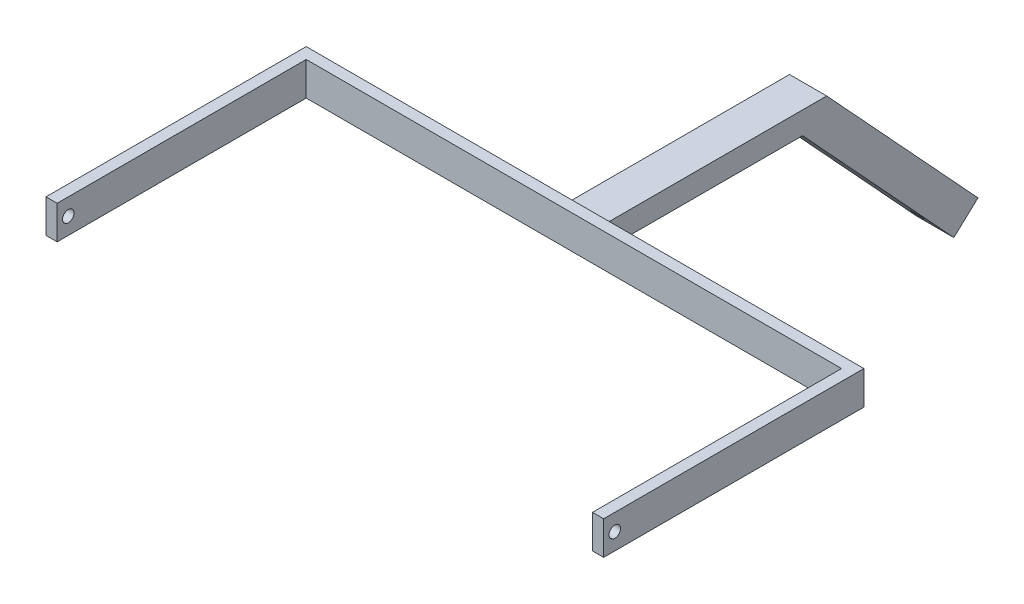
ISO-10303-21;
HEADER;
FILE_DESCRIPTION(('STEP AP214'),'2;1');
FILE_NAME('part.step','',(''),(''),'','','');
FILE_SCHEMA(('AUTOMOTIVE_DESIGN { 1 0 10303 214 1 1 1 1 }'));
ENDSEC;
DATA;
#1=APPLICATION_CONTEXT('core data for automotive mechanical design processes');
#2=APPLICATION_PROTOCOL_DEFINITION('international standard','automotive_design',2000,#1);
#3=PRODUCT_CONTEXT('',#1,'mechanical');
#4=PRODUCT('Part','Part','',(#3));
#5=PRODUCT_RELATED_PRODUCT_CATEGORY('part','',(#4));
#6=PRODUCT_DEFINITION_FORMATION('','',#4);
#7=PRODUCT_DEFINITION_CONTEXT('part definition',#1,'design');
#8=PRODUCT_DEFINITION('design','',#6,#7);
#9=PRODUCT_DEFINITION_SHAPE('','',#8);
#10=(LENGTH_UNIT() NAMED_UNIT(*) SI_UNIT(.MILLI.,.METRE.));
#11=(NAMED_UNIT(*) PLANE_ANGLE_UNIT() SI_UNIT($,.RADIAN.));
#12=(NAMED_UNIT(*) SI_UNIT($,.STERADIAN.) SOLID_ANGLE_UNIT());
#13=UNCERTAINTY_MEASURE_WITH_UNIT(LENGTH_MEASURE(1.E-05),#10,'distance_accuracy_value','');
#14=(GEOMETRIC_REPRESENTATION_CONTEXT(3) GLOBAL_UNCERTAINTY_ASSIGNED_CONTEXT((#13)) GLOBAL_UNIT_ASSIGNED_CONTEXT((#10,
#11,#12)) REPRESENTATION_CONTEXT('',''));
#15=CARTESIAN_POINT('',(0.,0.,0.));
#16=DIRECTION('',(0.,0.,1.));
#17=DIRECTION('',(1.,0.,0.));
#18=AXIS2_PLACEMENT_3D('',#15,#16,#17);
#19=CARTESIAN_POINT('',(0.,6.,-1.51515151515151));
#20=DIRECTION('',(0.,0.,1.));
#21=DIRECTION('',(1.,0.,0.));
#22=AXIS2_PLACEMENT_3D('',#19,#20,#21);
#23=PLANE('',#22);
#24=DIRECTION('',(0.,-1.,0.));
#25=VECTOR('',#24,1.);
#26=CARTESIAN_POINT('',(74.2424242424239,6.,-1.51515151515152));
#27=LINE('',#26,#25);
#28=CARTESIAN_POINT('',(74.2424242424239,7.5,-1.51515151515152));
#29=VERTEX_POINT('',#28);
#30=CARTESIAN_POINT('',(74.2424242424239,-1.5,-1.51515151515152));
#31=VERTEX_POINT('',#30);
#32=EDGE_CURVE('E324',#29,#31,#27,.T.);
#33=ORIENTED_EDGE('',*,*,#32,.T.);
#34=DIRECTION('',(1.,0.,0.));
#35=VECTOR('',#34,1.);
#36=CARTESIAN_POINT('',(-75.7575757575761,-1.5,-1.5151515151515));
#37=LINE('',#36,#35);
#38=CARTESIAN_POINT('',(-75.7575757575761,-1.5,-1.5151515151515));
#39=VERTEX_POINT('',#38);
#40=EDGE_CURVE('E264',#39,#31,#37,.T.);
#41=ORIENTED_EDGE('',*,*,#40,.F.);
#42=DIRECTION('',(0.,-1.,0.));
#43=VECTOR('',#42,1.);
#44=CARTESIAN_POINT('',(-75.7575757575761,6.,-1.5151515151515));
#45=LINE('',#44,#43);
#46=CARTESIAN_POINT('',(-75.7575757575761,7.5,-1.5151515151515));
#47=VERTEX_POINT('',#46);
#48=EDGE_CURVE('E61',#47,#39,#45,.T.);
#49=ORIENTED_EDGE('',*,*,#48,.F.);
#50=DIRECTION('',(-1.,0.,0.));
#51=VECTOR('',#50,1.);
#52=CARTESIAN_POINT('',(-75.7575757575761,7.5,-1.5151515151515));
#53=LINE('',#52,#51);
#54=EDGE_CURVE('E303',#29,#47,#53,.T.);
#55=ORIENTED_EDGE('',*,*,#54,.F.);
#56=EDGE_LOOP('',(#33,#41,#49,#55));
#57=FACE_BOUND('',#56,.T.);
#58=DIRECTION('',(0.,-1.,0.));
#59=VECTOR('',#58,1.);
#60=CARTESIAN_POINT('',(4.2424242424239,6.,-1.51515151515151));
#61=LINE('',#60,#59);
#62=CARTESIAN_POINT('',(4.2424242424239,6.,-1.51515151515151));
#63=VERTEX_POINT('',#62);
#64=CARTESIAN_POINT('',(4.2424242424239,0.,-1.51515151515151));
#65=VERTEX_POINT('',#64);
#66=EDGE_CURVE('E195',#63,#65,#61,.T.);
#67=ORIENTED_EDGE('',*,*,#66,.F.);
#68=DIRECTION('',(1.,0.,0.));
#69=VECTOR('',#68,1.);
#70=CARTESIAN_POINT('',(-3.7575757575761,6.,-1.51515151515151));
#71=LINE('',#70,#69);
#72=CARTESIAN_POINT('',(-5.7575757575761,6.,-1.51515151515151));
#73=VERTEX_POINT('',#72);
#74=EDGE_CURVE('E252',#73,#63,#71,.T.);
#75=ORIENTED_EDGE('',*,*,#74,.F.);
#76=DIRECTION('',(0.,1.,0.));
#77=VECTOR('',#76,1.);
#78=CARTESIAN_POINT('',(-5.7575757575761,0.,-1.51515151515151));
#79=LINE('',#78,#77);
#80=CARTESIAN_POINT('',(-5.7575757575761,0.,-1.51515151515151));
#81=VERTEX_POINT('',#80);
#82=EDGE_CURVE('E207',#81,#73,#79,.T.);
#83=ORIENTED_EDGE('',*,*,#82,.F.);
#84=DIRECTION('',(1.,0.,0.));
#85=VECTOR('',#84,1.);
#86=CARTESIAN_POINT('',(-3.7575757575761,0.,-1.51515151515151));
#87=LINE('',#86,#85);
#88=EDGE_CURVE('E256',#81,#65,#87,.T.);
#89=ORIENTED_EDGE('',*,*,#88,.T.);
#90=EDGE_LOOP('',(#67,#75,#83,#89));
#91=FACE_BOUND('',#90,.T.);
#92=ADVANCED_FACE('F36',(#57,#91),#23,.F.);
#93=CARTESIAN_POINT('',(-0.757575757576109,-39.7273835925875,-90.1159625137292));
#94=DIRECTION('',(0.,0.678280102733066,-0.734803444627488));
#95=DIRECTION('',(0.,0.734803444627488,0.678280102733066));
#96=AXIS2_PLACEMENT_3D('',#93,#94,#95);
#97=CYLINDRICAL_SURFACE('',#96,1.55);
#98=CARTESIAN_POINT('',(-0.757575757576109,-37.301142770723,-92.744390070749));
#99=DIRECTION('',(0.,-0.678280102733066,0.734803444627488));
#100=DIRECTION('',(0.,-0.734803444627488,-0.678280102733066));
#101=AXIS2_PLACEMENT_3D('',#98,#99,#100);
#102=CIRCLE('',#101,1.55);
#103=CARTESIAN_POINT('',(-0.757575757576109,-38.4400881098956,-93.7957242299853));
#104=VERTEX_POINT('',#103);
#105=EDGE_CURVE('E40',#104,#104,#102,.F.);
#106=ORIENTED_EDGE('',*,*,#105,.T.);
#107=EDGE_LOOP('',(#106));
#108=FACE_BOUND('',#107,.T.);
#109=CARTESIAN_POINT('',(-0.757575757576109,-38.9445825652569,-90.963996960004));
#110=DIRECTION('',(0.,0.678280102733066,-0.734803444627488));
#111=DIRECTION('',(0.,0.734803444627488,0.678280102733066));
#112=AXIS2_PLACEMENT_3D('',#109,#110,#111);
#113=CIRCLE('',#112,1.55);
#114=CARTESIAN_POINT('',(-0.757575757576109,-37.8056372260843,-89.9126628007678));
#115=VERTEX_POINT('',#114);
#116=EDGE_CURVE('E174',#115,#115,#113,.T.);
#117=ORIENTED_EDGE('',*,*,#116,.F.);
#118=EDGE_LOOP('',(#117));
#119=FACE_BOUND('',#118,.T.);
#120=ADVANCED_FACE('F334',(#108,#119),#97,.F.);
#121=CARTESIAN_POINT('',(0.,6.,1.48484848484847));
#122=DIRECTION('',(0.,0.,1.));
#123=DIRECTION('',(1.,0.,0.));
#124=AXIS2_PLACEMENT_3D('',#121,#122,#123);
#125=PLANE('',#124);
#126=DIRECTION('',(0.,-1.,0.));
#127=VECTOR('',#126,1.);
#128=CARTESIAN_POINT('',(-72.7575757575761,6.,1.48484848484851));
#129=LINE('',#128,#127);
#130=CARTESIAN_POINT('',(-72.7575757575761,7.5,1.48484848484851));
#131=VERTEX_POINT('',#130);
#132=CARTESIAN_POINT('',(-72.7575757575761,-1.5,1.48484848484851));
#133=VERTEX_POINT('',#132);
#134=EDGE_CURVE('E317',#131,#133,#129,.T.);
#135=ORIENTED_EDGE('',*,*,#134,.T.);
#136=DIRECTION('',(-1.,0.,0.));
#137=VECTOR('',#136,1.);
#138=CARTESIAN_POINT('',(71.2424242424239,-1.5,1.48484848484846));
#139=LINE('',#138,#137);
#140=CARTESIAN_POINT('',(71.2424242424239,-1.5,1.48484848484846));
#141=VERTEX_POINT('',#140);
#142=EDGE_CURVE('E276',#141,#133,#139,.T.);
#143=ORIENTED_EDGE('',*,*,#142,.F.);
#144=DIRECTION('',(0.,-1.,0.));
#145=VECTOR('',#144,1.);
#146=CARTESIAN_POINT('',(71.2424242424239,6.,1.48484848484846));
#147=LINE('',#146,#145);
#148=CARTESIAN_POINT('',(71.2424242424239,7.5,1.48484848484846));
#149=VERTEX_POINT('',#148);
#150=EDGE_CURVE('E11',#149,#141,#147,.T.);
#151=ORIENTED_EDGE('',*,*,#150,.F.);
#152=DIRECTION('',(1.,0.,0.));
#153=VECTOR('',#152,1.);
#154=CARTESIAN_POINT('',(71.2424242424239,7.5,1.48484848484846));
#155=LINE('',#154,#153);
#156=EDGE_CURVE('E291',#131,#149,#155,.T.);
#157=ORIENTED_EDGE('',*,*,#156,.F.);
#158=EDGE_LOOP('',(#135,#143,#151,#157));
#159=FACE_BOUND('',#158,.T.);
#160=ADVANCED_FACE('F38',(#159),#125,.T.);
#161=CARTESIAN_POINT('',(71.2424242424239,6.,0.));
#162=DIRECTION('',(1.,0.,0.));
#163=DIRECTION('',(0.,0.,-1.));
#164=AXIS2_PLACEMENT_3D('',#161,#162,#163);
#165=PLANE('',#164);
#166=CARTESIAN_POINT('',(71.2424242424239,3.,65.4848484848485));
#167=DIRECTION('',(1.,0.,0.));
#168=DIRECTION('',(0.,0.,-1.));
#169=AXIS2_PLACEMENT_3D('',#166,#167,#168);
#170=CIRCLE('',#169,1.54999999999999);
#171=CARTESIAN_POINT('',(71.2424242424239,3.,63.9348484848485));
#172=VERTEX_POINT('',#171);
#173=EDGE_CURVE('E308',#172,#172,#170,.T.);
#174=ORIENTED_EDGE('',*,*,#173,.T.);
#175=EDGE_LOOP('',(#174));
#176=FACE_BOUND('',#175,.T.);
#177=ORIENTED_EDGE('',*,*,#150,.T.);
#178=DIRECTION('',(0.,0.,-1.));
#179=VECTOR('',#178,1.);
#180=CARTESIAN_POINT('',(71.2424242424239,-1.5,68.4848484848485));
#181=LINE('',#180,#179);
#182=CARTESIAN_POINT('',(71.2424242424239,-1.5,68.4848484848485));
#183=VERTEX_POINT('',#182);
#184=EDGE_CURVE('E273',#183,#141,#181,.T.);
#185=ORIENTED_EDGE('',*,*,#184,.F.);
#186=DIRECTION('',(0.,-1.,0.));
#187=VECTOR('',#186,1.);
#188=CARTESIAN_POINT('',(71.2424242424239,6.,68.4848484848485));
#189=LINE('',#188,#187);
#190=CARTESIAN_POINT('',(71.2424242424239,7.5,68.4848484848485));
#191=VERTEX_POINT('',#190);
#192=EDGE_CURVE('E45',#191,#183,#189,.T.);
#193=ORIENTED_EDGE('',*,*,#192,.F.);
#194=DIRECTION('',(0.,0.,1.));
#195=VECTOR('',#194,1.);
#196=CARTESIAN_POINT('',(71.2424242424239,7.5,68.4848484848485));
#197=LINE('',#196,#195);
#198=EDGE_CURVE('E294',#149,#191,#197,.T.);
#199=ORIENTED_EDGE('',*,*,#198,.F.);
#200=EDGE_LOOP('',(#177,#185,#193,#199));
#201=FACE_BOUND('',#200,.T.);
#202=ADVANCED_FACE('F369',(#176,#201),#165,.F.);
#203=CARTESIAN_POINT('',(0.,6.,68.4848484848485));
#204=DIRECTION('',(0.,0.,1.));
#205=DIRECTION('',(1.,0.,0.));
#206=AXIS2_PLACEMENT_3D('',#203,#204,#205);
#207=PLANE('',#206);
#208=ORIENTED_EDGE('',*,*,#192,.T.);
#209=DIRECTION('',(-1.,0.,0.));
#210=VECTOR('',#209,1.);
#211=CARTESIAN_POINT('',(74.2424242424239,-1.5,68.4848484848485));
#212=LINE('',#211,#210);
#213=CARTESIAN_POINT('',(74.2424242424239,-1.5,68.4848484848485));
#214=VERTEX_POINT('',#213);
#215=EDGE_CURVE('E270',#214,#183,#212,.T.);
#216=ORIENTED_EDGE('',*,*,#215,.F.);
#217=DIRECTION('',(0.,-1.,0.));
#218=VECTOR('',#217,1.);
#219=CARTESIAN_POINT('',(74.2424242424239,6.,68.4848484848485));
#220=LINE('',#219,#218);
#221=CARTESIAN_POINT('',(74.2424242424239,7.5,68.4848484848485));
#222=VERTEX_POINT('',#221);
#223=EDGE_CURVE('E326',#222,#214,#220,.T.);
#224=ORIENTED_EDGE('',*,*,#223,.F.);
#225=DIRECTION('',(1.,0.,0.));
#226=VECTOR('',#225,1.);
#227=CARTESIAN_POINT('',(74.2424242424239,7.5,68.4848484848485));
#228=LINE('',#227,#226);
#229=EDGE_CURVE('E297',#191,#222,#228,.T.);
#230=ORIENTED_EDGE('',*,*,#229,.F.);
#231=EDGE_LOOP('',(#208,#216,#224,#230));
#232=FACE_BOUND('',#231,.T.);
#233=ADVANCED_FACE('F366',(#232),#207,.T.);
#234=CARTESIAN_POINT('',(74.2424242424239,6.,0.));
#235=DIRECTION('',(1.,0.,0.));
#236=DIRECTION('',(0.,0.,-1.));
#237=AXIS2_PLACEMENT_3D('',#234,#235,#236);
#238=PLANE('',#237);
#239=CARTESIAN_POINT('',(74.2424242424239,3.,65.4848484848485));
#240=DIRECTION('',(1.,0.,0.));
#241=DIRECTION('',(0.,0.,-1.));
#242=AXIS2_PLACEMENT_3D('',#239,#240,#241);
#243=CIRCLE('',#242,1.54999999999999);
#244=CARTESIAN_POINT('',(74.2424242424239,3.,63.9348484848485));
#245=VERTEX_POINT('',#244);
#246=EDGE_CURVE('E305',#245,#245,#243,.T.);
#247=ORIENTED_EDGE('',*,*,#246,.F.);
#248=EDGE_LOOP('',(#247));
#249=FACE_BOUND('',#248,.T.);
#250=ORIENTED_EDGE('',*,*,#223,.T.);
#251=DIRECTION('',(0.,0.,1.));
#252=VECTOR('',#251,1.);
#253=CARTESIAN_POINT('',(74.2424242424239,-1.5,-1.51515151515152));
#254=LINE('',#253,#252);
#255=EDGE_CURVE('E267',#31,#214,#254,.T.);
#256=ORIENTED_EDGE('',*,*,#255,.F.);
#257=ORIENTED_EDGE('',*,*,#32,.F.);
#258=DIRECTION('',(0.,0.,-1.));
#259=VECTOR('',#258,1.);
#260=CARTESIAN_POINT('',(74.2424242424239,7.5,-1.51515151515152));
#261=LINE('',#260,#259);
#262=EDGE_CURVE('E300',#222,#29,#261,.T.);
#263=ORIENTED_EDGE('',*,*,#262,.F.);
#264=EDGE_LOOP('',(#250,#256,#257,#263));
#265=FACE_BOUND('',#264,.T.);
#266=ADVANCED_FACE('F363',(#249,#265),#238,.T.);
#267=CARTESIAN_POINT('',(-75.7575757575761,6.,0.));
#268=DIRECTION('',(-1.,0.,0.));
#269=DIRECTION('',(0.,0.,1.));
#270=AXIS2_PLACEMENT_3D('',#267,#268,#269);
#271=PLANE('',#270);
#272=CARTESIAN_POINT('',(-75.7575757575761,3.,65.4848484848485));
#273=DIRECTION('',(-1.,0.,0.));
#274=DIRECTION('',(0.,0.,1.));
#275=AXIS2_PLACEMENT_3D('',#272,#273,#274);
#276=CIRCLE('',#275,1.54999999999999);
#277=CARTESIAN_POINT('',(-75.7575757575761,3.,67.0348484848485));
#278=VERTEX_POINT('',#277);
#279=EDGE_CURVE('E314',#278,#278,#276,.T.);
#280=ORIENTED_EDGE('',*,*,#279,.F.);
#281=EDGE_LOOP('',(#280));
#282=FACE_BOUND('',#281,.T.);
#283=ORIENTED_EDGE('',*,*,#48,.T.);
#284=DIRECTION('',(0.,0.,-1.));
#285=VECTOR('',#284,1.);
#286=CARTESIAN_POINT('',(-75.7575757575761,-1.5,68.4848484848485));
#287=LINE('',#286,#285);
#288=CARTESIAN_POINT('',(-75.7575757575761,-1.5,68.4848484848485));
#289=VERTEX_POINT('',#288);
#290=EDGE_CURVE('E261',#289,#39,#287,.T.);
#291=ORIENTED_EDGE('',*,*,#290,.F.);
#292=DIRECTION('',(0.,-1.,0.));
#293=VECTOR('',#292,1.);
#294=CARTESIAN_POINT('',(-75.7575757575761,6.,68.4848484848485));
#295=LINE('',#294,#293);
#296=CARTESIAN_POINT('',(-75.7575757575761,7.5,68.4848484848485));
#297=VERTEX_POINT('',#296);
#298=EDGE_CURVE('E321',#297,#289,#295,.T.);
#299=ORIENTED_EDGE('',*,*,#298,.F.);
#300=DIRECTION('',(0.,0.,1.));
#301=VECTOR('',#300,1.);
#302=CARTESIAN_POINT('',(-75.7575757575761,7.5,68.4848484848485));
#303=LINE('',#302,#301);
#304=EDGE_CURVE('E282',#47,#297,#303,.T.);
#305=ORIENTED_EDGE('',*,*,#304,.F.);
#306=EDGE_LOOP('',(#283,#291,#299,#305));
#307=FACE_BOUND('',#306,.T.);
#308=ADVANCED_FACE('F361',(#282,#307),#271,.T.);
#309=CARTESIAN_POINT('',(-3.16806065107685E-13,6.,68.4848484848488));
#310=DIRECTION('',(0.,0.,-1.));
#311=DIRECTION('',(-1.,0.,0.));
#312=AXIS2_PLACEMENT_3D('',#309,#310,#311);
#313=PLANE('',#312);
#314=ORIENTED_EDGE('',*,*,#298,.T.);
#315=DIRECTION('',(-1.,0.,0.));
#316=VECTOR('',#315,1.);
#317=CARTESIAN_POINT('',(-72.7575757575761,-1.5,68.4848484848485));
#318=LINE('',#317,#316);
#319=CARTESIAN_POINT('',(-72.7575757575761,-1.5,68.4848484848485));
#320=VERTEX_POINT('',#319);
#321=EDGE_CURVE('E255',#320,#289,#318,.T.);
#322=ORIENTED_EDGE('',*,*,#321,.F.);
#323=DIRECTION('',(0.,-1.,0.));
#324=VECTOR('',#323,1.);
#325=CARTESIAN_POINT('',(-72.7575757575761,6.,68.4848484848485));
#326=LINE('',#325,#324);
#327=CARTESIAN_POINT('',(-72.7575757575761,7.5,68.4848484848485));
#328=VERTEX_POINT('',#327);
#329=EDGE_CURVE('E319',#328,#320,#326,.T.);
#330=ORIENTED_EDGE('',*,*,#329,.F.);
#331=DIRECTION('',(1.,0.,0.));
#332=VECTOR('',#331,1.);
#333=CARTESIAN_POINT('',(-72.7575757575761,7.5,68.4848484848485));
#334=LINE('',#333,#332);
#335=EDGE_CURVE('E285',#297,#328,#334,.T.);
#336=ORIENTED_EDGE('',*,*,#335,.F.);
#337=EDGE_LOOP('',(#314,#322,#330,#336));
#338=FACE_BOUND('',#337,.T.);
#339=ADVANCED_FACE('F395',(#338),#313,.F.);
#340=CARTESIAN_POINT('',(-72.7575757575761,6.,0.));
#341=DIRECTION('',(1.,0.,0.));
#342=DIRECTION('',(0.,0.,-1.));
#343=AXIS2_PLACEMENT_3D('',#340,#341,#342);
#344=PLANE('',#343);
#345=CARTESIAN_POINT('',(-72.7575757575761,3.,65.4848484848485));
#346=DIRECTION('',(1.,0.,0.));
#347=DIRECTION('',(0.,0.,-1.));
#348=AXIS2_PLACEMENT_3D('',#345,#346,#347);
#349=CIRCLE('',#348,1.54999999999999);
#350=CARTESIAN_POINT('',(-72.7575757575761,3.,63.9348484848485));
#351=VERTEX_POINT('',#350);
#352=EDGE_CURVE('E311',#351,#351,#349,.T.);
#353=ORIENTED_EDGE('',*,*,#352,.F.);
#354=EDGE_LOOP('',(#353));
#355=FACE_BOUND('',#354,.T.);
#356=ORIENTED_EDGE('',*,*,#329,.T.);
#357=DIRECTION('',(0.,0.,1.));
#358=VECTOR('',#357,1.);
#359=CARTESIAN_POINT('',(-72.7575757575761,-1.5,1.48484848484851));
#360=LINE('',#359,#358);
#361=EDGE_CURVE('E279',#133,#320,#360,.T.);
#362=ORIENTED_EDGE('',*,*,#361,.F.);
#363=ORIENTED_EDGE('',*,*,#134,.F.);
#364=DIRECTION('',(0.,0.,-1.));
#365=VECTOR('',#364,1.);
#366=CARTESIAN_POINT('',(-72.7575757575761,7.5,1.48484848484851));
#367=LINE('',#366,#365);
#368=EDGE_CURVE('E288',#328,#131,#367,.T.);
#369=ORIENTED_EDGE('',*,*,#368,.F.);
#370=EDGE_LOOP('',(#356,#362,#363,#369));
#371=FACE_BOUND('',#370,.T.);
#372=ADVANCED_FACE('F389',(#355,#371),#344,.T.);
#373=CARTESIAN_POINT('',(-82.7575757575761,3.,65.4848484848485));
#374=DIRECTION('',(1.,0.,0.));
#375=DIRECTION('',(0.,0.,-1.));
#376=AXIS2_PLACEMENT_3D('',#373,#374,#375);
#377=CYLINDRICAL_SURFACE('',#376,1.54999999999999);
#378=ORIENTED_EDGE('',*,*,#279,.T.);
#379=EDGE_LOOP('',(#378));
#380=FACE_BOUND('',#379,.T.);
#381=ORIENTED_EDGE('',*,*,#352,.T.);
#382=EDGE_LOOP('',(#381));
#383=FACE_BOUND('',#382,.T.);
#384=ADVANCED_FACE('F410',(#380,#383),#377,.F.);
#385=CARTESIAN_POINT('',(64.2424242424239,3.,65.4848484848485));
#386=DIRECTION('',(1.,0.,0.));
#387=DIRECTION('',(0.,0.,-1.));
#388=AXIS2_PLACEMENT_3D('',#385,#386,#387);
#389=CYLINDRICAL_SURFACE('',#388,1.54999999999999);
#390=ORIENTED_EDGE('',*,*,#246,.T.);
#391=EDGE_LOOP('',(#390));
#392=FACE_BOUND('',#391,.T.);
#393=ORIENTED_EDGE('',*,*,#173,.F.);
#394=EDGE_LOOP('',(#393));
#395=FACE_BOUND('',#394,.T.);
#396=ADVANCED_FACE('F413',(#392,#395),#389,.F.);
#397=CARTESIAN_POINT('',(0.,7.5,0.));
#398=DIRECTION('',(0.,-1.,0.));
#399=DIRECTION('',(0.,0.,-1.));
#400=AXIS2_PLACEMENT_3D('',#397,#398,#399);
#401=PLANE('',#400);
#402=ORIENTED_EDGE('',*,*,#304,.T.);
#403=ORIENTED_EDGE('',*,*,#335,.T.);
#404=ORIENTED_EDGE('',*,*,#368,.T.);
#405=ORIENTED_EDGE('',*,*,#156,.T.);
#406=ORIENTED_EDGE('',*,*,#198,.T.);
#407=ORIENTED_EDGE('',*,*,#229,.T.);
#408=ORIENTED_EDGE('',*,*,#262,.T.);
#409=ORIENTED_EDGE('',*,*,#54,.T.);
#410=EDGE_LOOP('',(#402,#403,#404,#405,#406,#407,#408,#409));
#411=FACE_BOUND('',#410,.T.);
#412=ADVANCED_FACE('F391',(#411),#401,.F.);
#413=CARTESIAN_POINT('',(0.,-1.5,0.));
#414=DIRECTION('',(0.,-1.,0.));
#415=DIRECTION('',(0.,0.,-1.));
#416=AXIS2_PLACEMENT_3D('',#413,#414,#415);
#417=PLANE('',#416);
#418=ORIENTED_EDGE('',*,*,#321,.T.);
#419=ORIENTED_EDGE('',*,*,#290,.T.);
#420=ORIENTED_EDGE('',*,*,#40,.T.);
#421=ORIENTED_EDGE('',*,*,#255,.T.);
#422=ORIENTED_EDGE('',*,*,#215,.T.);
#423=ORIENTED_EDGE('',*,*,#184,.T.);
#424=ORIENTED_EDGE('',*,*,#142,.T.);
#425=ORIENTED_EDGE('',*,*,#361,.T.);
#426=EDGE_LOOP('',(#418,#419,#420,#421,#422,#423,#424,#425));
#427=FACE_BOUND('',#426,.T.);
#428=ADVANCED_FACE('F384',(#427),#417,.T.);
#429=CARTESIAN_POINT('',(-3.7575757575761,6.,-61.5151515151515));
#430=DIRECTION('',(0.,-1.,0.));
#431=DIRECTION('',(1.,0.,0.));
#432=AXIS2_PLACEMENT_3D('',#429,#430,#431);
#433=PLANE('',#432);
#434=ORIENTED_EDGE('',*,*,#74,.T.);
#435=DIRECTION('',(0.,0.,1.));
#436=VECTOR('',#435,1.);
#437=CARTESIAN_POINT('',(4.2424242424239,5.99999999999999,-61.5151515151515));
#438=LINE('',#437,#436);
#439=CARTESIAN_POINT('',(4.2424242424239,5.99999999999999,-61.5151515151515));
#440=VERTEX_POINT('',#439);
#441=EDGE_CURVE('E192',#440,#63,#438,.T.);
#442=ORIENTED_EDGE('',*,*,#441,.F.);
#443=DIRECTION('',(1.,0.,0.));
#444=VECTOR('',#443,1.);
#445=CARTESIAN_POINT('',(-3.7575757575761,6.,-61.5151515151515));
#446=LINE('',#445,#444);
#447=CARTESIAN_POINT('',(-5.7575757575761,5.99999999999999,-61.5151515151515));
#448=VERTEX_POINT('',#447);
#449=EDGE_CURVE('E253',#448,#440,#446,.T.);
#450=ORIENTED_EDGE('',*,*,#449,.F.);
#451=DIRECTION('',(0.,0.,-1.));
#452=VECTOR('',#451,1.);
#453=CARTESIAN_POINT('',(-5.7575757575761,6.,-1.51515151515151));
#454=LINE('',#453,#452);
#455=EDGE_CURVE('E210',#73,#448,#454,.T.);
#456=ORIENTED_EDGE('',*,*,#455,.F.);
#457=EDGE_LOOP('',(#434,#442,#450,#456));
#458=FACE_BOUND('',#457,.T.);
#459=ADVANCED_FACE('F429',(#458),#433,.F.);
#460=CARTESIAN_POINT('',(-3.7575757575761,0.,-61.5151515151515));
#461=DIRECTION('',(0.,-1.,0.));
#462=DIRECTION('',(1.,0.,0.));
#463=AXIS2_PLACEMENT_3D('',#460,#461,#462);
#464=PLANE('',#463);
#465=DIRECTION('',(1.,0.,0.));
#466=VECTOR('',#465,1.);
#467=CARTESIAN_POINT('',(-57.7575757575761,0.,-55.0151515151515));
#468=LINE('',#467,#466);
#469=CARTESIAN_POINT('',(-5.7575757575761,0.,-55.0151515151515));
#470=VERTEX_POINT('',#469);
#471=CARTESIAN_POINT('',(4.2424242424239,0.,-55.0151515151515));
#472=VERTEX_POINT('',#471);
#473=EDGE_CURVE('E250',#470,#472,#468,.T.);
#474=ORIENTED_EDGE('',*,*,#473,.T.);
#475=DIRECTION('',(0.,0.,-1.));
#476=VECTOR('',#475,1.);
#477=CARTESIAN_POINT('',(4.2424242424239,0.,-1.51515151515151));
#478=LINE('',#477,#476);
#479=EDGE_CURVE('E188',#65,#472,#478,.T.);
#480=ORIENTED_EDGE('',*,*,#479,.F.);
#481=ORIENTED_EDGE('',*,*,#88,.F.);
#482=DIRECTION('',(0.,0.,1.));
#483=VECTOR('',#482,1.);
#484=CARTESIAN_POINT('',(-5.7575757575761,0.,-55.0151515151515));
#485=LINE('',#484,#483);
#486=EDGE_CURVE('E204',#470,#81,#485,.T.);
#487=ORIENTED_EDGE('',*,*,#486,.F.);
#488=EDGE_LOOP('',(#474,#480,#481,#487));
#489=FACE_BOUND('',#488,.T.);
#490=ADVANCED_FACE('F432',(#489),#464,.T.);
#491=CARTESIAN_POINT('',(2.24242424242389,-44.0882066776493,-95.7119576791355));
#492=DIRECTION('',(0.,0.678280102733066,-0.734803444627488));
#493=DIRECTION('',(0.,0.734803444627488,0.678280102733066));
#494=AXIS2_PLACEMENT_3D('',#491,#492,#493);
#495=PLANE('',#494);
#496=ORIENTED_EDGE('',*,*,#116,.T.);
#497=EDGE_LOOP('',(#496));
#498=FACE_BOUND('',#497,.T.);
#499=ORIENTED_EDGE('',*,*,#473,.F.);
#500=DIRECTION('',(0.,0.734803444627488,0.678280102733066));
#501=VECTOR('',#500,1.);
#502=CARTESIAN_POINT('',(-5.75757575757611,-44.0882066776493,-95.7119576791355));
#503=LINE('',#502,#501);
#504=CARTESIAN_POINT('',(-5.75757575757611,-44.0882066776493,-95.7119576791355));
#505=VERTEX_POINT('',#504);
#506=EDGE_CURVE('E169',#505,#470,#503,.T.);
#507=ORIENTED_EDGE('',*,*,#506,.F.);
#508=DIRECTION('',(-1.,0.,0.));
#509=VECTOR('',#508,1.);
#510=CARTESIAN_POINT('',(2.24242424242389,-44.0882066776493,-95.7119576791355));
#511=LINE('',#510,#509);
#512=CARTESIAN_POINT('',(4.24242424242389,-44.0882066776493,-95.7119576791355));
#513=VERTEX_POINT('',#512);
#514=EDGE_CURVE('E163',#513,#505,#511,.T.);
#515=ORIENTED_EDGE('',*,*,#514,.F.);
#516=DIRECTION('',(0.,-0.734803444627488,-0.678280102733066));
#517=VECTOR('',#516,1.);
#518=CARTESIAN_POINT('',(4.2424242424239,0.,-55.0151515151515));
#519=LINE('',#518,#517);
#520=EDGE_CURVE('E167',#472,#513,#519,.T.);
#521=ORIENTED_EDGE('',*,*,#520,.F.);
#522=EDGE_LOOP('',(#499,#507,#515,#521));
#523=FACE_BOUND('',#522,.T.);
#524=ADVANCED_FACE('F165',(#498,#523),#495,.F.);
#525=CARTESIAN_POINT('',(-3.75757575757611,-38.0882066776493,-102.211957679135));
#526=DIRECTION('',(0.,-0.678280102733066,0.734803444627488));
#527=DIRECTION('',(0.,-0.734803444627488,-0.678280102733066));
#528=AXIS2_PLACEMENT_3D('',#525,#526,#527);
#529=PLANE('',#528);
#530=CARTESIAN_POINT('',(-0.757575757576109,-32.9445825652569,-97.463996960004));
#531=DIRECTION('',(0.,0.678280102733066,-0.734803444627488));
#532=DIRECTION('',(0.,0.734803444627488,0.678280102733066));
#533=AXIS2_PLACEMENT_3D('',#530,#531,#532);
#534=CIRCLE('',#533,1.55);
#535=CARTESIAN_POINT('',(-0.757575757576109,-31.8056372260842,-96.4126628007678));
#536=VERTEX_POINT('',#535);
#537=EDGE_CURVE('E244',#536,#536,#534,.T.);
#538=ORIENTED_EDGE('',*,*,#537,.F.);
#539=EDGE_LOOP('',(#538));
#540=FACE_BOUND('',#539,.T.);
#541=ORIENTED_EDGE('',*,*,#449,.T.);
#542=DIRECTION('',(0.,0.734803444627488,0.678280102733066));
#543=VECTOR('',#542,1.);
#544=CARTESIAN_POINT('',(4.24242424242389,-38.0882066776493,-102.211957679135));
#545=LINE('',#544,#543);
#546=CARTESIAN_POINT('',(4.24242424242389,-38.0882066776493,-102.211957679135));
#547=VERTEX_POINT('',#546);
#548=EDGE_CURVE('E182',#547,#440,#545,.T.);
#549=ORIENTED_EDGE('',*,*,#548,.F.);
#550=DIRECTION('',(1.,0.,0.));
#551=VECTOR('',#550,1.);
#552=CARTESIAN_POINT('',(-3.75757575757611,-38.0882066776493,-102.211957679135));
#553=LINE('',#552,#551);
#554=CARTESIAN_POINT('',(-5.75757575757611,-38.0882066776493,-102.211957679135));
#555=VERTEX_POINT('',#554);
#556=EDGE_CURVE('E173',#555,#547,#553,.T.);
#557=ORIENTED_EDGE('',*,*,#556,.F.);
#558=DIRECTION('',(0.,-0.734803444627488,-0.678280102733066));
#559=VECTOR('',#558,1.);
#560=CARTESIAN_POINT('',(-5.7575757575761,5.99999999999999,-61.5151515151515));
#561=LINE('',#560,#559);
#562=EDGE_CURVE('E198',#448,#555,#561,.T.);
#563=ORIENTED_EDGE('',*,*,#562,.F.);
#564=EDGE_LOOP('',(#541,#549,#557,#563));
#565=FACE_BOUND('',#564,.T.);
#566=ADVANCED_FACE('F439',(#540,#565),#529,.F.);
#567=CARTESIAN_POINT('',(0.,-71.5078988066066,-66.0072912060984));
#568=DIRECTION('',(0.,-0.734803444627488,-0.678280102733066));
#569=DIRECTION('',(0.,0.678280102733066,-0.734803444627488));
#570=AXIS2_PLACEMENT_3D('',#567,#568,#569);
#571=PLANE('',#570);
#572=DIRECTION('',(0.,0.678280102733065,-0.734803444627488));
#573=VECTOR('',#572,1.);
#574=CARTESIAN_POINT('',(-3.25757575757611,-39.7316464721832,-100.43156456839));
#575=LINE('',#574,#573);
#576=CARTESIAN_POINT('',(-3.25757575757611,-42.4447668831154,-97.4923507898805));
#577=VERTEX_POINT('',#576);
#578=CARTESIAN_POINT('',(-3.25757575757611,-39.7316464721831,-100.43156456839));
#579=VERTEX_POINT('',#578);
#580=EDGE_CURVE('E53',#577,#579,#575,.T.);
#581=ORIENTED_EDGE('',*,*,#580,.F.);
#582=DIRECTION('',(-1.,0.,0.));
#583=VECTOR('',#582,1.);
#584=CARTESIAN_POINT('',(1.74242424242389,-42.4447668831154,-97.4923507898805));
#585=LINE('',#584,#583);
#586=CARTESIAN_POINT('',(1.74242424242389,-42.4447668831154,-97.4923507898805));
#587=VERTEX_POINT('',#586);
#588=EDGE_CURVE('E217',#587,#577,#585,.T.);
#589=ORIENTED_EDGE('',*,*,#588,.F.);
#590=DIRECTION('',(0.,-0.678280102733065,0.734803444627488));
#591=VECTOR('',#590,1.);
#592=CARTESIAN_POINT('',(1.74242424242389,-39.7316464721832,-100.43156456839));
#593=LINE('',#592,#591);
#594=CARTESIAN_POINT('',(1.74242424242389,-39.7316464721832,-100.43156456839));
#595=VERTEX_POINT('',#594);
#596=EDGE_CURVE('E231',#595,#587,#593,.T.);
#597=ORIENTED_EDGE('',*,*,#596,.F.);
#598=DIRECTION('',(1.,0.,0.));
#599=VECTOR('',#598,1.);
#600=CARTESIAN_POINT('',(1.74242424242389,-39.7316464721832,-100.43156456839));
#601=LINE('',#600,#599);
#602=EDGE_CURVE('E228',#579,#595,#601,.T.);
#603=ORIENTED_EDGE('',*,*,#602,.F.);
#604=EDGE_LOOP('',(#581,#589,#597,#603));
#605=FACE_BOUND('',#604,.T.);
#606=ORIENTED_EDGE('',*,*,#514,.T.);
#607=DIRECTION('',(0.,-0.678280102733065,0.734803444627488));
#608=VECTOR('',#607,1.);
#609=CARTESIAN_POINT('',(-5.75757575757611,-38.0882066776493,-102.211957679135));
#610=LINE('',#609,#608);
#611=EDGE_CURVE('E201',#555,#505,#610,.T.);
#612=ORIENTED_EDGE('',*,*,#611,.F.);
#613=ORIENTED_EDGE('',*,*,#556,.T.);
#614=DIRECTION('',(0.,0.678280102733065,-0.734803444627488));
#615=VECTOR('',#614,1.);
#616=CARTESIAN_POINT('',(4.24242424242389,-44.0882066776493,-95.7119576791355));
#617=LINE('',#616,#615);
#618=EDGE_CURVE('E177',#513,#547,#617,.T.);
#619=ORIENTED_EDGE('',*,*,#618,.F.);
#620=EDGE_LOOP('',(#606,#612,#613,#619));
#621=FACE_BOUND('',#620,.T.);
#622=ADVANCED_FACE('F178',(#605,#621),#571,.T.);
#623=CARTESIAN_POINT('',(-0.757575757576109,-34.5880223597907,-95.683603849259));
#624=DIRECTION('',(0.,0.678280102733066,-0.734803444627488));
#625=DIRECTION('',(0.,0.734803444627488,0.678280102733066));
#626=AXIS2_PLACEMENT_3D('',#623,#624,#625);
#627=CIRCLE('',#626,1.55);
#628=CARTESIAN_POINT('',(-0.757575757576109,-33.4490770206181,-94.6322696900228));
#629=VERTEX_POINT('',#628);
#630=EDGE_CURVE('E238',#629,#629,#627,.F.);
#631=ORIENTED_EDGE('',*,*,#630,.T.);
#632=EDGE_LOOP('',(#631));
#633=FACE_BOUND('',#632,.T.);
#634=ORIENTED_EDGE('',*,*,#537,.T.);
#635=EDGE_LOOP('',(#634));
#636=FACE_BOUND('',#635,.T.);
#637=ADVANCED_FACE('F340',(#633,#636),#97,.F.);
#638=CARTESIAN_POINT('',(1.74242424242389,-35.0967324368405,-90.7095497625499));
#639=DIRECTION('',(0.,-0.678280102733066,0.734803444627488));
#640=DIRECTION('',(0.,-0.734803444627488,-0.678280102733066));
#641=AXIS2_PLACEMENT_3D('',#638,#639,#640);
#642=PLANE('',#641);
#643=ORIENTED_EDGE('',*,*,#588,.T.);
#644=DIRECTION('',(0.,-0.734803444627488,-0.678280102733066));
#645=VECTOR('',#644,1.);
#646=CARTESIAN_POINT('',(-3.25757575757611,-35.0967324368405,-90.7095497625499));
#647=LINE('',#646,#645);
#648=CARTESIAN_POINT('',(-3.25757575757611,-35.0967324368405,-90.7095497625499));
#649=VERTEX_POINT('',#648);
#650=EDGE_CURVE('E236',#649,#577,#647,.T.);
#651=ORIENTED_EDGE('',*,*,#650,.F.);
#652=DIRECTION('',(-1.,0.,0.));
#653=VECTOR('',#652,1.);
#654=CARTESIAN_POINT('',(1.74242424242389,-35.0967324368405,-90.7095497625499));
#655=LINE('',#654,#653);
#656=CARTESIAN_POINT('',(1.74242424242389,-35.0967324368405,-90.7095497625499));
#657=VERTEX_POINT('',#656);
#658=EDGE_CURVE('E223',#657,#649,#655,.T.);
#659=ORIENTED_EDGE('',*,*,#658,.F.);
#660=DIRECTION('',(0.,-0.734803444627488,-0.678280102733066));
#661=VECTOR('',#660,1.);
#662=CARTESIAN_POINT('',(1.74242424242389,-35.0967324368405,-90.7095497625499));
#663=LINE('',#662,#661);
#664=EDGE_CURVE('E239',#657,#587,#663,.T.);
#665=ORIENTED_EDGE('',*,*,#664,.T.);
#666=EDGE_LOOP('',(#643,#651,#659,#665));
#667=FACE_BOUND('',#666,.T.);
#668=ORIENTED_EDGE('',*,*,#105,.F.);
#669=EDGE_LOOP('',(#668));
#670=FACE_BOUND('',#669,.T.);
#671=ADVANCED_FACE('F337',(#667,#670),#642,.F.);
#672=CARTESIAN_POINT('',(1.74242424242389,-32.3836120259083,-93.6487635410598));
#673=DIRECTION('',(0.,0.678280102733066,-0.734803444627488));
#674=DIRECTION('',(0.,0.734803444627488,0.678280102733066));
#675=AXIS2_PLACEMENT_3D('',#672,#673,#674);
#676=PLANE('',#675);
#677=ORIENTED_EDGE('',*,*,#602,.T.);
#678=DIRECTION('',(0.,-0.734803444627488,-0.678280102733066));
#679=VECTOR('',#678,1.);
#680=CARTESIAN_POINT('',(1.74242424242389,-32.3836120259083,-93.6487635410598));
#681=LINE('',#680,#679);
#682=CARTESIAN_POINT('',(1.74242424242389,-32.3836120259083,-93.6487635410598));
#683=VERTEX_POINT('',#682);
#684=EDGE_CURVE('E241',#683,#595,#681,.T.);
#685=ORIENTED_EDGE('',*,*,#684,.F.);
#686=DIRECTION('',(1.,0.,0.));
#687=VECTOR('',#686,1.);
#688=CARTESIAN_POINT('',(1.74242424242389,-32.3836120259083,-93.6487635410598));
#689=LINE('',#688,#687);
#690=CARTESIAN_POINT('',(-3.25757575757611,-32.3836120259083,-93.6487635410598));
#691=VERTEX_POINT('',#690);
#692=EDGE_CURVE('E216',#691,#683,#689,.T.);
#693=ORIENTED_EDGE('',*,*,#692,.F.);
#694=DIRECTION('',(0.,-0.734803444627488,-0.678280102733066));
#695=VECTOR('',#694,1.);
#696=CARTESIAN_POINT('',(-3.25757575757611,-32.3836120259083,-93.6487635410598));
#697=LINE('',#696,#695);
#698=EDGE_CURVE('E226',#691,#579,#697,.T.);
#699=ORIENTED_EDGE('',*,*,#698,.T.);
#700=EDGE_LOOP('',(#677,#685,#693,#699));
#701=FACE_BOUND('',#700,.T.);
#702=ORIENTED_EDGE('',*,*,#630,.F.);
#703=EDGE_LOOP('',(#702));
#704=FACE_BOUND('',#703,.T.);
#705=ADVANCED_FACE('F339',(#701,#704),#676,.F.);
#706=CARTESIAN_POINT('',(-3.25757575757611,-32.3836120259083,-93.6487635410598));
#707=DIRECTION('',(-1.,0.,0.));
#708=DIRECTION('',(0.,0.,1.));
#709=AXIS2_PLACEMENT_3D('',#706,#707,#708);
#710=PLANE('',#709);
#711=ORIENTED_EDGE('',*,*,#580,.T.);
#712=ORIENTED_EDGE('',*,*,#698,.F.);
#713=DIRECTION('',(0.,0.678280102733065,-0.734803444627488));
#714=VECTOR('',#713,1.);
#715=CARTESIAN_POINT('',(-3.25757575757611,-32.3836120259083,-93.6487635410598));
#716=LINE('',#715,#714);
#717=EDGE_CURVE('E213',#649,#691,#716,.T.);
#718=ORIENTED_EDGE('',*,*,#717,.F.);
#719=ORIENTED_EDGE('',*,*,#650,.T.);
#720=EDGE_LOOP('',(#711,#712,#718,#719));
#721=FACE_BOUND('',#720,.T.);
#722=ADVANCED_FACE('F347',(#721),#710,.F.);
#723=CARTESIAN_POINT('',(1.74242424242389,-32.3836120259083,-93.6487635410598));
#724=DIRECTION('',(1.,0.,0.));
#725=DIRECTION('',(0.,0.,-1.));
#726=AXIS2_PLACEMENT_3D('',#723,#724,#725);
#727=PLANE('',#726);
#728=ORIENTED_EDGE('',*,*,#596,.T.);
#729=ORIENTED_EDGE('',*,*,#664,.F.);
#730=DIRECTION('',(0.,-0.678280102733065,0.734803444627488));
#731=VECTOR('',#730,1.);
#732=CARTESIAN_POINT('',(1.74242424242389,-32.3836120259083,-93.6487635410598));
#733=LINE('',#732,#731);
#734=EDGE_CURVE('E220',#683,#657,#733,.T.);
#735=ORIENTED_EDGE('',*,*,#734,.F.);
#736=ORIENTED_EDGE('',*,*,#684,.T.);
#737=EDGE_LOOP('',(#728,#729,#735,#736));
#738=FACE_BOUND('',#737,.T.);
#739=ADVANCED_FACE('F448',(#738),#727,.F.);
#740=CARTESIAN_POINT('',(0.,-64.1598643603318,-59.2244901787677));
#741=DIRECTION('',(0.,-0.734803444627489,-0.678280102733065));
#742=DIRECTION('',(0.,0.678280102733065,-0.734803444627489));
#743=AXIS2_PLACEMENT_3D('',#740,#741,#742);
#744=PLANE('',#743);
#745=ORIENTED_EDGE('',*,*,#717,.T.);
#746=ORIENTED_EDGE('',*,*,#692,.T.);
#747=ORIENTED_EDGE('',*,*,#734,.T.);
#748=ORIENTED_EDGE('',*,*,#658,.T.);
#749=EDGE_LOOP('',(#745,#746,#747,#748));
#750=FACE_BOUND('',#749,.T.);
#751=ADVANCED_FACE('F450',(#750),#744,.T.);
#752=CARTESIAN_POINT('',(-5.7575757575761,0.,0.));
#753=DIRECTION('',(-1.,0.,0.));
#754=DIRECTION('',(0.,0.,1.));
#755=AXIS2_PLACEMENT_3D('',#752,#753,#754);
#756=PLANE('',#755);
#757=ORIENTED_EDGE('',*,*,#562,.T.);
#758=ORIENTED_EDGE('',*,*,#611,.T.);
#759=ORIENTED_EDGE('',*,*,#506,.T.);
#760=ORIENTED_EDGE('',*,*,#486,.T.);
#761=ORIENTED_EDGE('',*,*,#82,.T.);
#762=ORIENTED_EDGE('',*,*,#455,.T.);
#763=EDGE_LOOP('',(#757,#758,#759,#760,#761,#762));
#764=FACE_BOUND('',#763,.T.);
#765=ADVANCED_FACE('F455',(#764),#756,.T.);
#766=CARTESIAN_POINT('',(4.2424242424239,0.,0.));
#767=DIRECTION('',(1.,0.,0.));
#768=DIRECTION('',(0.,0.,-1.));
#769=AXIS2_PLACEMENT_3D('',#766,#767,#768);
#770=PLANE('',#769);
#771=ORIENTED_EDGE('',*,*,#520,.T.);
#772=ORIENTED_EDGE('',*,*,#618,.T.);
#773=ORIENTED_EDGE('',*,*,#548,.T.);
#774=ORIENTED_EDGE('',*,*,#441,.T.);
#775=ORIENTED_EDGE('',*,*,#66,.T.);
#776=ORIENTED_EDGE('',*,*,#479,.T.);
#777=EDGE_LOOP('',(#771,#772,#773,#774,#775,#776));
#778=FACE_BOUND('',#777,.T.);
#779=ADVANCED_FACE('F185',(#778),#770,.T.);
#780=CLOSED_SHELL('',(#92,#120,#160,#202,#233,#266,#308,#339,#372,#384,#396,#412,#428,#459,#490,
#524,#566,#622,#637,#671,#705,#722,#739,#751,#765,#779));
#781=MANIFOLD_SOLID_BREP('B2',#780);
#782=ADVANCED_BREP_SHAPE_REPRESENTATION('',(#18,#781),#14);
#783=SHAPE_DEFINITION_REPRESENTATION(#9,#782);
ENDSEC;
END-ISO-10303-21;
